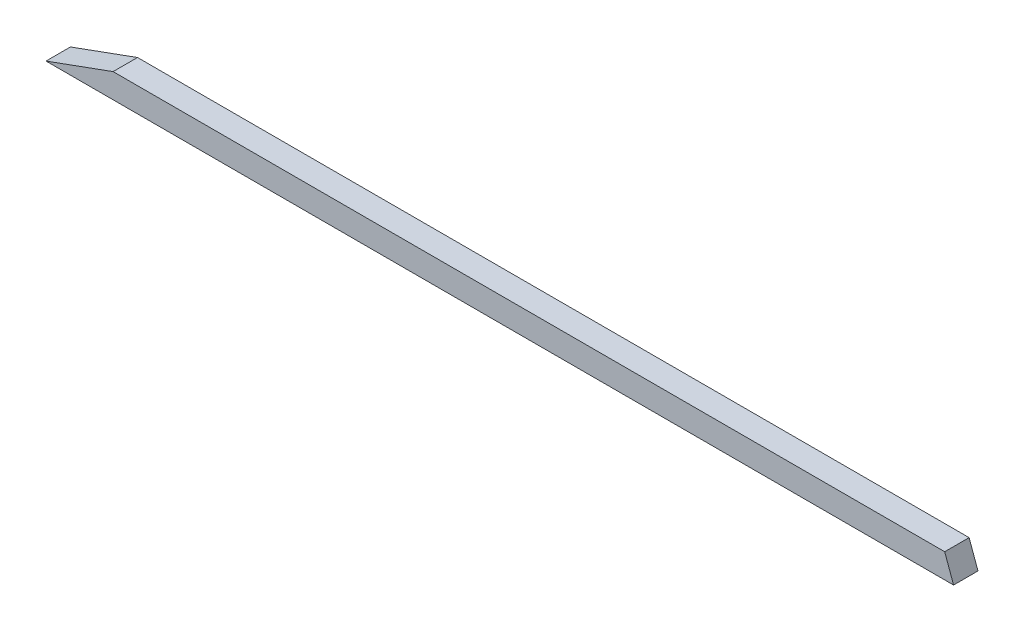
ISO-10303-21;
HEADER;
FILE_DESCRIPTION(('STEP AP214'),'2;1');
FILE_NAME('part.step','',(''),(''),'','','');
FILE_SCHEMA(('AUTOMOTIVE_DESIGN { 1 0 10303 214 1 1 1 1 }'));
ENDSEC;
DATA;
#1=APPLICATION_CONTEXT('core data for automotive mechanical design processes');
#2=APPLICATION_PROTOCOL_DEFINITION('international standard','automotive_design',2000,#1);
#3=PRODUCT_CONTEXT('',#1,'mechanical');
#4=PRODUCT('Part','Part','',(#3));
#5=PRODUCT_RELATED_PRODUCT_CATEGORY('part','',(#4));
#6=PRODUCT_DEFINITION_FORMATION('','',#4);
#7=PRODUCT_DEFINITION_CONTEXT('part definition',#1,'design');
#8=PRODUCT_DEFINITION('design','',#6,#7);
#9=PRODUCT_DEFINITION_SHAPE('','',#8);
#10=(LENGTH_UNIT() NAMED_UNIT(*) SI_UNIT(.MILLI.,.METRE.));
#11=(NAMED_UNIT(*) PLANE_ANGLE_UNIT() SI_UNIT($,.RADIAN.));
#12=(NAMED_UNIT(*) SI_UNIT($,.STERADIAN.) SOLID_ANGLE_UNIT());
#13=UNCERTAINTY_MEASURE_WITH_UNIT(LENGTH_MEASURE(1.E-05),#10,'distance_accuracy_value','');
#14=(GEOMETRIC_REPRESENTATION_CONTEXT(3) GLOBAL_UNCERTAINTY_ASSIGNED_CONTEXT((#13)) GLOBAL_UNIT_ASSIGNED_CONTEXT((#10,
#11,#12)) REPRESENTATION_CONTEXT('',''));
#15=CARTESIAN_POINT('',(0.,0.,0.));
#16=DIRECTION('',(0.,0.,1.));
#17=DIRECTION('',(1.,0.,0.));
#18=AXIS2_PLACEMENT_3D('',#15,#16,#17);
#19=CARTESIAN_POINT('',(0.,20.,20.));
#20=DIRECTION('',(0.,-1.,0.));
#21=DIRECTION('',(0.,0.,-1.));
#22=AXIS2_PLACEMENT_3D('',#19,#20,#21);
#23=PLANE('',#22);
#24=DIRECTION('',(0.,0.,1.));
#25=VECTOR('',#24,1.);
#26=CARTESIAN_POINT('',(736.048769388683,20.,0.));
#27=LINE('',#26,#25);
#28=CARTESIAN_POINT('',(736.048769388683,20.,0.));
#29=VERTEX_POINT('',#28);
#30=CARTESIAN_POINT('',(736.048769388683,20.,20.));
#31=VERTEX_POINT('',#30);
#32=EDGE_CURVE('E83',#29,#31,#27,.T.);
#33=ORIENTED_EDGE('',*,*,#32,.F.);
#34=DIRECTION('',(-1.,0.,0.));
#35=VECTOR('',#34,1.);
#36=CARTESIAN_POINT('',(0.,20.,0.));
#37=LINE('',#36,#35);
#38=CARTESIAN_POINT('',(54.9495483890936,20.,0.));
#39=VERTEX_POINT('',#38);
#40=EDGE_CURVE('E48',#29,#39,#37,.T.);
#41=ORIENTED_EDGE('',*,*,#40,.T.);
#42=DIRECTION('',(0.,0.,1.));
#43=VECTOR('',#42,1.);
#44=CARTESIAN_POINT('',(54.9495483890936,20.,0.));
#45=LINE('',#44,#43);
#46=CARTESIAN_POINT('',(54.9495483890936,20.,20.));
#47=VERTEX_POINT('',#46);
#48=EDGE_CURVE('E92',#39,#47,#45,.T.);
#49=ORIENTED_EDGE('',*,*,#48,.T.);
#50=DIRECTION('',(-1.,0.,0.));
#51=VECTOR('',#50,1.);
#52=CARTESIAN_POINT('',(0.,20.,20.));
#53=LINE('',#52,#51);
#54=EDGE_CURVE('E41',#31,#47,#53,.T.);
#55=ORIENTED_EDGE('',*,*,#54,.F.);
#56=EDGE_LOOP('',(#33,#41,#49,#55));
#57=FACE_BOUND('',#56,.T.);
#58=ADVANCED_FACE('F33',(#57),#23,.F.);
#59=CARTESIAN_POINT('',(0.,0.,20.));
#60=DIRECTION('',(0.,0.,-1.));
#61=DIRECTION('',(-1.,0.,0.));
#62=AXIS2_PLACEMENT_3D('',#59,#60,#61);
#63=PLANE('',#62);
#64=DIRECTION('',(-0.342020143325665,0.93969262078591,0.));
#65=VECTOR('',#64,1.);
#66=CARTESIAN_POINT('',(743.328174074006,0.,20.));
#67=LINE('',#66,#65);
#68=CARTESIAN_POINT('',(743.328174074006,0.,20.));
#69=VERTEX_POINT('',#68);
#70=EDGE_CURVE('E74',#69,#31,#67,.T.);
#71=ORIENTED_EDGE('',*,*,#70,.T.);
#72=ORIENTED_EDGE('',*,*,#54,.T.);
#73=DIRECTION('',(0.939692620785911,0.342020143325662,0.));
#74=VECTOR('',#73,1.);
#75=CARTESIAN_POINT('',(0.,0.,20.));
#76=LINE('',#75,#74);
#77=CARTESIAN_POINT('',(0.,0.,20.));
#78=VERTEX_POINT('',#77);
#79=EDGE_CURVE('E100',#78,#47,#76,.T.);
#80=ORIENTED_EDGE('',*,*,#79,.F.);
#81=DIRECTION('',(1.,0.,0.));
#82=VECTOR('',#81,1.);
#83=CARTESIAN_POINT('',(0.,0.,20.));
#84=LINE('',#83,#82);
#85=EDGE_CURVE('E90',#78,#69,#84,.T.);
#86=ORIENTED_EDGE('',*,*,#85,.T.);
#87=EDGE_LOOP('',(#71,#72,#80,#86));
#88=FACE_BOUND('',#87,.T.);
#89=ADVANCED_FACE('F88',(#88),#63,.F.);
#90=CARTESIAN_POINT('',(0.,0.,0.));
#91=DIRECTION('',(0.,0.,-1.));
#92=DIRECTION('',(-1.,0.,0.));
#93=AXIS2_PLACEMENT_3D('',#90,#91,#92);
#94=PLANE('',#93);
#95=ORIENTED_EDGE('',*,*,#40,.F.);
#96=DIRECTION('',(-0.342020143325665,0.93969262078591,0.));
#97=VECTOR('',#96,1.);
#98=CARTESIAN_POINT('',(743.328174074006,0.,0.));
#99=LINE('',#98,#97);
#100=CARTESIAN_POINT('',(743.328174074006,0.,0.));
#101=VERTEX_POINT('',#100);
#102=EDGE_CURVE('E80',#101,#29,#99,.T.);
#103=ORIENTED_EDGE('',*,*,#102,.F.);
#104=DIRECTION('',(1.,0.,0.));
#105=VECTOR('',#104,1.);
#106=CARTESIAN_POINT('',(0.,0.,0.));
#107=LINE('',#106,#105);
#108=CARTESIAN_POINT('',(0.,0.,0.));
#109=VERTEX_POINT('',#108);
#110=EDGE_CURVE('E97',#109,#101,#107,.T.);
#111=ORIENTED_EDGE('',*,*,#110,.F.);
#112=DIRECTION('',(0.939692620785911,0.342020143325662,0.));
#113=VECTOR('',#112,1.);
#114=CARTESIAN_POINT('',(0.,0.,0.));
#115=LINE('',#114,#113);
#116=EDGE_CURVE('E56',#109,#39,#115,.T.);
#117=ORIENTED_EDGE('',*,*,#116,.T.);
#118=EDGE_LOOP('',(#95,#103,#111,#117));
#119=FACE_BOUND('',#118,.T.);
#120=ADVANCED_FACE('F106',(#119),#94,.T.);
#121=CARTESIAN_POINT('',(0.,0.,20.));
#122=DIRECTION('',(0.,1.,0.));
#123=DIRECTION('',(0.,0.,1.));
#124=AXIS2_PLACEMENT_3D('',#121,#122,#123);
#125=PLANE('',#124);
#126=ORIENTED_EDGE('',*,*,#110,.T.);
#127=DIRECTION('',(0.,0.,1.));
#128=VECTOR('',#127,1.);
#129=CARTESIAN_POINT('',(743.328174074006,0.,0.));
#130=LINE('',#129,#128);
#131=EDGE_CURVE('E85',#101,#69,#130,.T.);
#132=ORIENTED_EDGE('',*,*,#131,.T.);
#133=ORIENTED_EDGE('',*,*,#85,.F.);
#134=DIRECTION('',(0.,0.,-1.));
#135=VECTOR('',#134,1.);
#136=CARTESIAN_POINT('',(0.,0.,20.));
#137=LINE('',#136,#135);
#138=EDGE_CURVE('E11',#78,#109,#137,.T.);
#139=ORIENTED_EDGE('',*,*,#138,.T.);
#140=EDGE_LOOP('',(#126,#132,#133,#139));
#141=FACE_BOUND('',#140,.T.);
#142=ADVANCED_FACE('F35',(#141),#125,.F.);
#143=CARTESIAN_POINT('',(0.,0.,0.));
#144=DIRECTION('',(0.342020143325662,-0.939692620785911,0.));
#145=DIRECTION('',(0.939692620785911,0.342020143325662,0.));
#146=AXIS2_PLACEMENT_3D('',#143,#144,#145);
#147=PLANE('',#146);
#148=ORIENTED_EDGE('',*,*,#79,.T.);
#149=ORIENTED_EDGE('',*,*,#48,.F.);
#150=ORIENTED_EDGE('',*,*,#116,.F.);
#151=ORIENTED_EDGE('',*,*,#138,.F.);
#152=EDGE_LOOP('',(#148,#149,#150,#151));
#153=FACE_BOUND('',#152,.T.);
#154=ADVANCED_FACE('F107',(#153),#147,.F.);
#155=CARTESIAN_POINT('',(743.328174074006,0.,0.));
#156=DIRECTION('',(0.93969262078591,0.342020143325665,0.));
#157=DIRECTION('',(-0.342020143325665,0.93969262078591,0.));
#158=AXIS2_PLACEMENT_3D('',#155,#156,#157);
#159=PLANE('',#158);
#160=ORIENTED_EDGE('',*,*,#70,.F.);
#161=ORIENTED_EDGE('',*,*,#131,.F.);
#162=ORIENTED_EDGE('',*,*,#102,.T.);
#163=ORIENTED_EDGE('',*,*,#32,.T.);
#164=EDGE_LOOP('',(#160,#161,#162,#163));
#165=FACE_BOUND('',#164,.T.);
#166=ADVANCED_FACE('F84',(#165),#159,.T.);
#167=CLOSED_SHELL('',(#58,#89,#120,#142,#154,#166));
#168=MANIFOLD_SOLID_BREP('B2',#167);
#169=ADVANCED_BREP_SHAPE_REPRESENTATION('',(#18,#168),#14);
#170=SHAPE_DEFINITION_REPRESENTATION(#9,#169);
ENDSEC;
END-ISO-10303-21;
